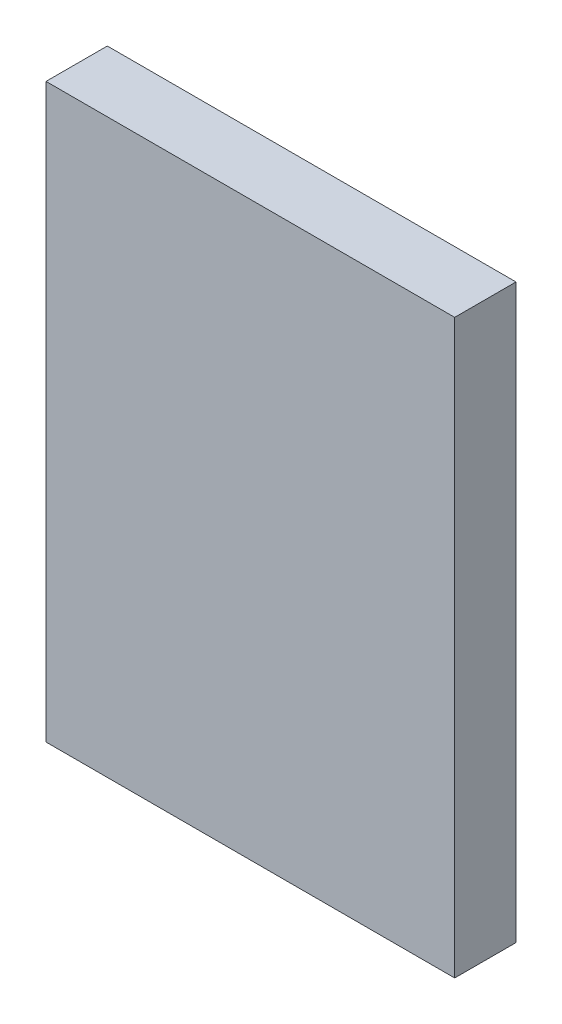
ISO-10303-21;
HEADER;
FILE_DESCRIPTION(('STEP AP214'),'2;1');
FILE_NAME('part.step','',(''),(''),'','','');
FILE_SCHEMA(('AUTOMOTIVE_DESIGN { 1 0 10303 214 1 1 1 1 }'));
ENDSEC;
DATA;
#1=APPLICATION_CONTEXT('core data for automotive mechanical design processes');
#2=APPLICATION_PROTOCOL_DEFINITION('international standard','automotive_design',2000,#1);
#3=PRODUCT_CONTEXT('',#1,'mechanical');
#4=PRODUCT('Part','Part','',(#3));
#5=PRODUCT_RELATED_PRODUCT_CATEGORY('part','',(#4));
#6=PRODUCT_DEFINITION_FORMATION('','',#4);
#7=PRODUCT_DEFINITION_CONTEXT('part definition',#1,'design');
#8=PRODUCT_DEFINITION('design','',#6,#7);
#9=PRODUCT_DEFINITION_SHAPE('','',#8);
#10=(LENGTH_UNIT() NAMED_UNIT(*) SI_UNIT(.MILLI.,.METRE.));
#11=(NAMED_UNIT(*) PLANE_ANGLE_UNIT() SI_UNIT($,.RADIAN.));
#12=(NAMED_UNIT(*) SI_UNIT($,.STERADIAN.) SOLID_ANGLE_UNIT());
#13=UNCERTAINTY_MEASURE_WITH_UNIT(LENGTH_MEASURE(1.E-05),#10,'distance_accuracy_value','');
#14=(GEOMETRIC_REPRESENTATION_CONTEXT(3) GLOBAL_UNCERTAINTY_ASSIGNED_CONTEXT((#13)) GLOBAL_UNIT_ASSIGNED_CONTEXT((#10,
#11,#12)) REPRESENTATION_CONTEXT('',''));
#15=CARTESIAN_POINT('',(0.,0.,0.));
#16=DIRECTION('',(0.,0.,1.));
#17=DIRECTION('',(1.,0.,0.));
#18=AXIS2_PLACEMENT_3D('',#15,#16,#17);
#19=CARTESIAN_POINT('',(8.,-1.4,5.2));
#20=DIRECTION('',(0.,0.,1.));
#21=DIRECTION('',(1.,0.,0.));
#22=AXIS2_PLACEMENT_3D('',#19,#20,#21);
#23=PLANE('',#22);
#24=DIRECTION('',(0.,1.,0.));
#25=VECTOR('',#24,1.);
#26=CARTESIAN_POINT('',(10.,-1.4,5.2));
#27=LINE('',#26,#25);
#28=CARTESIAN_POINT('',(10.,1.4,5.2));
#29=VERTEX_POINT('',#28);
#30=CARTESIAN_POINT('',(10.,-1.4,5.2));
#31=VERTEX_POINT('',#30);
#32=EDGE_CURVE('E76',#29,#31,#27,.F.);
#33=ORIENTED_EDGE('',*,*,#32,.F.);
#34=DIRECTION('',(1.,0.,0.));
#35=VECTOR('',#34,1.);
#36=CARTESIAN_POINT('',(8.,1.4,5.2));
#37=LINE('',#36,#35);
#38=CARTESIAN_POINT('',(8.,1.4,5.2));
#39=VERTEX_POINT('',#38);
#40=EDGE_CURVE('E58',#39,#29,#37,.T.);
#41=ORIENTED_EDGE('',*,*,#40,.F.);
#42=DIRECTION('',(0.,1.,0.));
#43=VECTOR('',#42,1.);
#44=CARTESIAN_POINT('',(8.,-1.4,5.2));
#45=LINE('',#44,#43);
#46=CARTESIAN_POINT('',(8.,-1.4,5.2));
#47=VERTEX_POINT('',#46);
#48=EDGE_CURVE('E20',#39,#47,#45,.F.);
#49=ORIENTED_EDGE('',*,*,#48,.T.);
#50=DIRECTION('',(1.,0.,0.));
#51=VECTOR('',#50,1.);
#52=CARTESIAN_POINT('',(8.,-1.4,5.2));
#53=LINE('',#52,#51);
#54=EDGE_CURVE('E55',#47,#31,#53,.T.);
#55=ORIENTED_EDGE('',*,*,#54,.T.);
#56=EDGE_LOOP('',(#33,#41,#49,#55));
#57=FACE_BOUND('',#56,.T.);
#58=ADVANCED_FACE('F17',(#57),#23,.T.);
#59=CARTESIAN_POINT('',(8.,-1.4,4.9));
#60=DIRECTION('',(1.,0.,0.));
#61=DIRECTION('',(0.,0.,-1.));
#62=AXIS2_PLACEMENT_3D('',#59,#60,#61);
#63=PLANE('',#62);
#64=DIRECTION('',(0.,0.,1.));
#65=VECTOR('',#64,1.);
#66=CARTESIAN_POINT('',(8.,1.4,4.9));
#67=LINE('',#66,#65);
#68=CARTESIAN_POINT('',(8.,1.4,4.9));
#69=VERTEX_POINT('',#68);
#70=EDGE_CURVE('E78',#69,#39,#67,.T.);
#71=ORIENTED_EDGE('',*,*,#70,.F.);
#72=DIRECTION('',(0.,1.,0.));
#73=VECTOR('',#72,1.);
#74=CARTESIAN_POINT('',(8.,-1.4,4.9));
#75=LINE('',#74,#73);
#76=CARTESIAN_POINT('',(8.,-1.4,4.9));
#77=VERTEX_POINT('',#76);
#78=EDGE_CURVE('E73',#69,#77,#75,.F.);
#79=ORIENTED_EDGE('',*,*,#78,.T.);
#80=DIRECTION('',(0.,0.,1.));
#81=VECTOR('',#80,1.);
#82=CARTESIAN_POINT('',(8.,-1.4,4.9));
#83=LINE('',#82,#81);
#84=EDGE_CURVE('E63',#77,#47,#83,.T.);
#85=ORIENTED_EDGE('',*,*,#84,.T.);
#86=ORIENTED_EDGE('',*,*,#48,.F.);
#87=EDGE_LOOP('',(#71,#79,#85,#86));
#88=FACE_BOUND('',#87,.T.);
#89=ADVANCED_FACE('F72',(#88),#63,.F.);
#90=CARTESIAN_POINT('',(8.,-1.4,4.9));
#91=DIRECTION('',(0.,1.,0.));
#92=DIRECTION('',(0.,0.,1.));
#93=AXIS2_PLACEMENT_3D('',#90,#91,#92);
#94=PLANE('',#93);
#95=ORIENTED_EDGE('',*,*,#54,.F.);
#96=ORIENTED_EDGE('',*,*,#84,.F.);
#97=DIRECTION('',(1.,0.,0.));
#98=VECTOR('',#97,1.);
#99=CARTESIAN_POINT('',(8.,-1.4,4.9));
#100=LINE('',#99,#98);
#101=CARTESIAN_POINT('',(10.,-1.4,4.9));
#102=VERTEX_POINT('',#101);
#103=EDGE_CURVE('E83',#77,#102,#100,.T.);
#104=ORIENTED_EDGE('',*,*,#103,.T.);
#105=DIRECTION('',(0.,0.,-1.));
#106=VECTOR('',#105,1.);
#107=CARTESIAN_POINT('',(10.,-1.4,4.9));
#108=LINE('',#107,#106);
#109=EDGE_CURVE('E69',#31,#102,#108,.T.);
#110=ORIENTED_EDGE('',*,*,#109,.F.);
#111=EDGE_LOOP('',(#95,#96,#104,#110));
#112=FACE_BOUND('',#111,.T.);
#113=ADVANCED_FACE('F66',(#112),#94,.F.);
#114=CARTESIAN_POINT('',(10.,-1.4,4.9));
#115=DIRECTION('',(1.,0.,0.));
#116=DIRECTION('',(0.,0.,-1.));
#117=AXIS2_PLACEMENT_3D('',#114,#115,#116);
#118=PLANE('',#117);
#119=DIRECTION('',(0.,0.,1.));
#120=VECTOR('',#119,1.);
#121=CARTESIAN_POINT('',(10.,1.4,4.9));
#122=LINE('',#121,#120);
#123=CARTESIAN_POINT('',(10.,1.4,4.9));
#124=VERTEX_POINT('',#123);
#125=EDGE_CURVE('E34',#29,#124,#122,.F.);
#126=ORIENTED_EDGE('',*,*,#125,.F.);
#127=ORIENTED_EDGE('',*,*,#32,.T.);
#128=ORIENTED_EDGE('',*,*,#109,.T.);
#129=DIRECTION('',(0.,1.,0.));
#130=VECTOR('',#129,1.);
#131=CARTESIAN_POINT('',(10.,-1.4,4.9));
#132=LINE('',#131,#130);
#133=EDGE_CURVE('E26',#102,#124,#132,.T.);
#134=ORIENTED_EDGE('',*,*,#133,.T.);
#135=EDGE_LOOP('',(#126,#127,#128,#134));
#136=FACE_BOUND('',#135,.T.);
#137=ADVANCED_FACE('F88',(#136),#118,.T.);
#138=CARTESIAN_POINT('',(8.,1.4,4.9));
#139=DIRECTION('',(0.,1.,0.));
#140=DIRECTION('',(0.,0.,1.));
#141=AXIS2_PLACEMENT_3D('',#138,#139,#140);
#142=PLANE('',#141);
#143=ORIENTED_EDGE('',*,*,#40,.T.);
#144=ORIENTED_EDGE('',*,*,#125,.T.);
#145=DIRECTION('',(1.,0.,0.));
#146=VECTOR('',#145,1.);
#147=CARTESIAN_POINT('',(8.,1.4,4.9));
#148=LINE('',#147,#146);
#149=EDGE_CURVE('E11',#124,#69,#148,.F.);
#150=ORIENTED_EDGE('',*,*,#149,.T.);
#151=ORIENTED_EDGE('',*,*,#70,.T.);
#152=EDGE_LOOP('',(#143,#144,#150,#151));
#153=FACE_BOUND('',#152,.T.);
#154=ADVANCED_FACE('F91',(#153),#142,.T.);
#155=CARTESIAN_POINT('',(8.,-1.4,4.9));
#156=DIRECTION('',(0.,0.,1.));
#157=DIRECTION('',(1.,0.,0.));
#158=AXIS2_PLACEMENT_3D('',#155,#156,#157);
#159=PLANE('',#158);
#160=ORIENTED_EDGE('',*,*,#133,.F.);
#161=ORIENTED_EDGE('',*,*,#103,.F.);
#162=ORIENTED_EDGE('',*,*,#78,.F.);
#163=ORIENTED_EDGE('',*,*,#149,.F.);
#164=EDGE_LOOP('',(#160,#161,#162,#163));
#165=FACE_BOUND('',#164,.T.);
#166=ADVANCED_FACE('F90',(#165),#159,.F.);
#167=CLOSED_SHELL('',(#58,#89,#113,#137,#154,#166));
#168=MANIFOLD_SOLID_BREP('B1',#167);
#169=ADVANCED_BREP_SHAPE_REPRESENTATION('',(#18,#168),#14);
#170=SHAPE_DEFINITION_REPRESENTATION(#9,#169);
ENDSEC;
END-ISO-10303-21;
